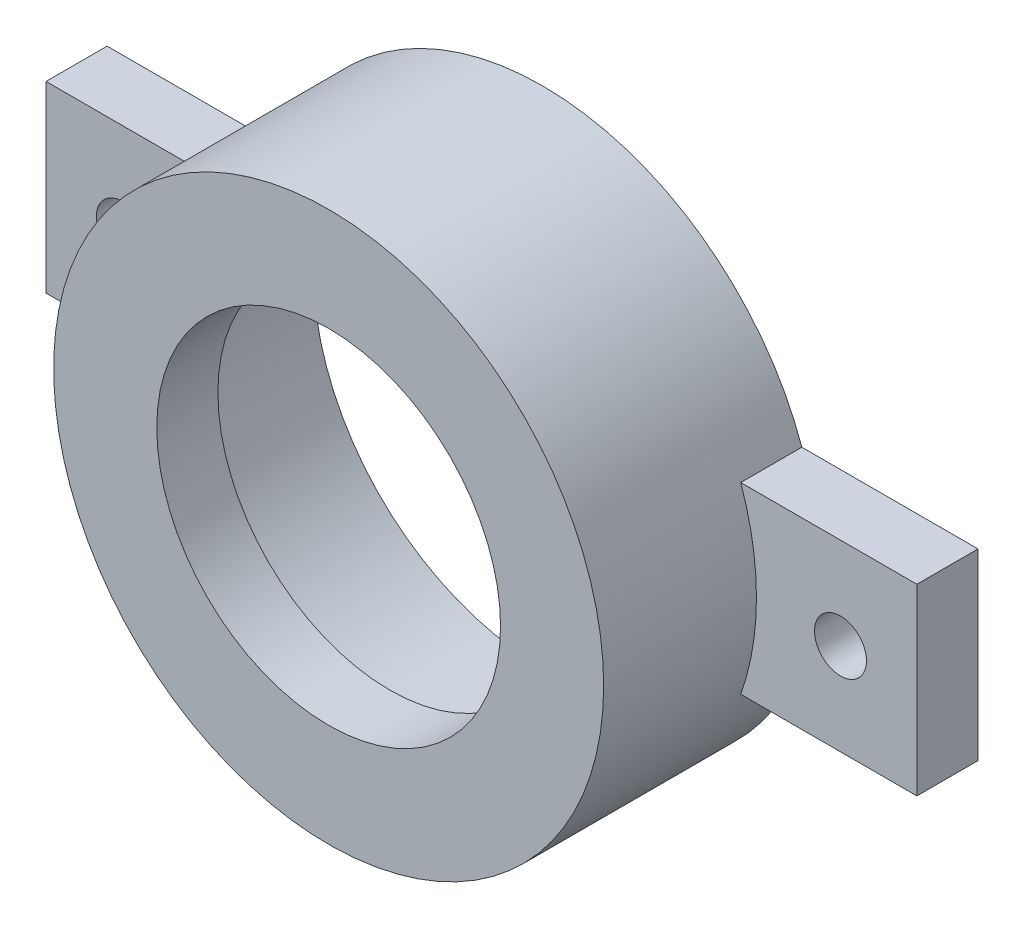
ISO-10303-21;
HEADER;
FILE_DESCRIPTION(('STEP AP214'),'2;1');
FILE_NAME('part.step','',(''),(''),'','','');
FILE_SCHEMA(('AUTOMOTIVE_DESIGN { 1 0 10303 214 1 1 1 1 }'));
ENDSEC;
DATA;
#1=APPLICATION_CONTEXT('core data for automotive mechanical design processes');
#2=APPLICATION_PROTOCOL_DEFINITION('international standard','automotive_design',2000,#1);
#3=PRODUCT_CONTEXT('',#1,'mechanical');
#4=PRODUCT('Part','Part','',(#3));
#5=PRODUCT_RELATED_PRODUCT_CATEGORY('part','',(#4));
#6=PRODUCT_DEFINITION_FORMATION('','',#4);
#7=PRODUCT_DEFINITION_CONTEXT('part definition',#1,'design');
#8=PRODUCT_DEFINITION('design','',#6,#7);
#9=PRODUCT_DEFINITION_SHAPE('','',#8);
#10=(LENGTH_UNIT() NAMED_UNIT(*) SI_UNIT(.MILLI.,.METRE.));
#11=(NAMED_UNIT(*) PLANE_ANGLE_UNIT() SI_UNIT($,.RADIAN.));
#12=(NAMED_UNIT(*) SI_UNIT($,.STERADIAN.) SOLID_ANGLE_UNIT());
#13=UNCERTAINTY_MEASURE_WITH_UNIT(LENGTH_MEASURE(1.E-05),#10,'distance_accuracy_value','');
#14=(GEOMETRIC_REPRESENTATION_CONTEXT(3) GLOBAL_UNCERTAINTY_ASSIGNED_CONTEXT((#13)) GLOBAL_UNIT_ASSIGNED_CONTEXT((#10,
#11,#12)) REPRESENTATION_CONTEXT('',''));
#15=CARTESIAN_POINT('',(0.,0.,0.));
#16=DIRECTION('',(0.,0.,1.));
#17=DIRECTION('',(1.,0.,0.));
#18=AXIS2_PLACEMENT_3D('',#15,#16,#17);
#19=CARTESIAN_POINT('',(-180.,0.,83.));
#20=DIRECTION('',(0.,0.,1.));
#21=DIRECTION('',(1.,0.,0.));
#22=AXIS2_PLACEMENT_3D('',#19,#20,#21);
#23=PLANE('',#22);
#24=CARTESIAN_POINT('',(-180.,0.,83.));
#25=DIRECTION('',(0.,0.,1.));
#26=DIRECTION('',(1.,0.,0.));
#27=AXIS2_PLACEMENT_3D('',#24,#25,#26);
#28=CIRCLE('',#27,11.25);
#29=CARTESIAN_POINT('',(-168.75,0.,83.));
#30=VERTEX_POINT('',#29);
#31=EDGE_CURVE('E9',#30,#30,#28,.T.);
#32=ORIENTED_EDGE('',*,*,#31,.T.);
#33=EDGE_LOOP('',(#32));
#34=FACE_BOUND('',#33,.T.);
#35=CARTESIAN_POINT('',(-180.,0.,83.));
#36=DIRECTION('',(0.,0.,1.));
#37=DIRECTION('',(1.,0.,0.));
#38=AXIS2_PLACEMENT_3D('',#35,#36,#37);
#39=CIRCLE('',#38,15.);
#40=CARTESIAN_POINT('',(-165.,0.,83.));
#41=VERTEX_POINT('',#40);
#42=EDGE_CURVE('E277',#41,#41,#39,.T.);
#43=ORIENTED_EDGE('',*,*,#42,.F.);
#44=EDGE_LOOP('',(#43));
#45=FACE_BOUND('',#44,.T.);
#46=ADVANCED_FACE('F14',(#34,#45),#23,.F.);
#47=CARTESIAN_POINT('',(-180.,0.,53.));
#48=DIRECTION('',(0.,0.,1.));
#49=DIRECTION('',(1.,0.,0.));
#50=AXIS2_PLACEMENT_3D('',#47,#48,#49);
#51=CYLINDRICAL_SURFACE('',#50,11.25);
#52=DIRECTION('',(0.,0.,1.));
#53=VECTOR('',#52,1.);
#54=CARTESIAN_POINT('',(-168.75,0.,53.));
#55=LINE('',#54,#53);
#56=CARTESIAN_POINT('',(-168.75,0.,87.));
#57=VERTEX_POINT('',#56);
#58=EDGE_CURVE('E25',#30,#57,#55,.T.);
#59=ORIENTED_EDGE('',*,*,#58,.F.);
#60=ORIENTED_EDGE('',*,*,#31,.F.);
#61=ORIENTED_EDGE('',*,*,#58,.T.);
#62=CARTESIAN_POINT('',(-180.,0.,87.));
#63=DIRECTION('',(0.,0.,1.));
#64=DIRECTION('',(1.,0.,0.));
#65=AXIS2_PLACEMENT_3D('',#62,#63,#64);
#66=CIRCLE('',#65,11.25);
#67=EDGE_CURVE('E262',#57,#57,#66,.T.);
#68=ORIENTED_EDGE('',*,*,#67,.T.);
#69=EDGE_LOOP('',(#59,#60,#61,#68));
#70=FACE_BOUND('',#69,.T.);
#71=ADVANCED_FACE('F326',(#70),#51,.F.);
#72=CARTESIAN_POINT('',(-180.,0.,72.99));
#73=DIRECTION('',(0.,0.,1.));
#74=DIRECTION('',(1.,0.,0.));
#75=AXIS2_PLACEMENT_3D('',#72,#73,#74);
#76=CYLINDRICAL_SURFACE('',#75,15.);
#77=CARTESIAN_POINT('',(-180.,0.,73.));
#78=DIRECTION('',(0.,0.,1.));
#79=DIRECTION('',(1.,0.,0.));
#80=AXIS2_PLACEMENT_3D('',#77,#78,#79);
#81=CIRCLE('',#80,15.);
#82=CARTESIAN_POINT('',(-165.,0.,73.));
#83=VERTEX_POINT('',#82);
#84=EDGE_CURVE('E244',#83,#83,#81,.T.);
#85=ORIENTED_EDGE('',*,*,#84,.F.);
#86=DIRECTION('',(0.,0.,1.));
#87=VECTOR('',#86,1.);
#88=CARTESIAN_POINT('',(-165.,0.,72.99));
#89=LINE('',#88,#87);
#90=EDGE_CURVE('E268',#83,#41,#89,.T.);
#91=ORIENTED_EDGE('',*,*,#90,.T.);
#92=ORIENTED_EDGE('',*,*,#42,.T.);
#93=ORIENTED_EDGE('',*,*,#90,.F.);
#94=EDGE_LOOP('',(#85,#91,#92,#93));
#95=FACE_BOUND('',#94,.T.);
#96=ADVANCED_FACE('F345',(#95),#76,.F.);
#97=CARTESIAN_POINT('',(-203.5,0.,72.99));
#98=DIRECTION('',(0.,0.,1.));
#99=DIRECTION('',(1.,0.,0.));
#100=AXIS2_PLACEMENT_3D('',#97,#98,#99);
#101=CYLINDRICAL_SURFACE('',#100,1.7);
#102=DIRECTION('',(0.,0.,1.));
#103=VECTOR('',#102,1.);
#104=CARTESIAN_POINT('',(-201.8,0.,72.99));
#105=LINE('',#104,#103);
#106=CARTESIAN_POINT('',(-201.8,0.,73.));
#107=VERTEX_POINT('',#106);
#108=CARTESIAN_POINT('',(-201.8,0.,77.));
#109=VERTEX_POINT('',#108);
#110=EDGE_CURVE('E261',#107,#109,#105,.T.);
#111=ORIENTED_EDGE('',*,*,#110,.F.);
#112=CARTESIAN_POINT('',(-203.5,0.,73.));
#113=DIRECTION('',(0.,0.,1.));
#114=DIRECTION('',(1.,0.,0.));
#115=AXIS2_PLACEMENT_3D('',#112,#113,#114);
#116=CIRCLE('',#115,1.7);
#117=EDGE_CURVE('E130',#107,#107,#116,.T.);
#118=ORIENTED_EDGE('',*,*,#117,.F.);
#119=ORIENTED_EDGE('',*,*,#110,.T.);
#120=CARTESIAN_POINT('',(-203.5,0.,77.));
#121=DIRECTION('',(0.,0.,1.));
#122=DIRECTION('',(1.,0.,0.));
#123=AXIS2_PLACEMENT_3D('',#120,#121,#122);
#124=CIRCLE('',#123,1.7);
#125=EDGE_CURVE('E174',#109,#109,#124,.T.);
#126=ORIENTED_EDGE('',*,*,#125,.T.);
#127=EDGE_LOOP('',(#111,#118,#119,#126));
#128=FACE_BOUND('',#127,.T.);
#129=ADVANCED_FACE('F349',(#128),#101,.F.);
#130=CARTESIAN_POINT('',(-208.5,-6.,73.));
#131=DIRECTION('',(1.,0.,0.));
#132=DIRECTION('',(0.,1.,0.));
#133=AXIS2_PLACEMENT_3D('',#130,#131,#132);
#134=PLANE('',#133);
#135=DIRECTION('',(0.,1.,0.));
#136=VECTOR('',#135,1.);
#137=CARTESIAN_POINT('',(-208.5,-6.,77.));
#138=LINE('',#137,#136);
#139=CARTESIAN_POINT('',(-208.5,-6.,77.));
#140=VERTEX_POINT('',#139);
#141=CARTESIAN_POINT('',(-208.5,6.,77.));
#142=VERTEX_POINT('',#141);
#143=EDGE_CURVE('E165',#140,#142,#138,.T.);
#144=ORIENTED_EDGE('',*,*,#143,.T.);
#145=DIRECTION('',(0.,0.,1.));
#146=VECTOR('',#145,1.);
#147=CARTESIAN_POINT('',(-208.5,6.,73.));
#148=LINE('',#147,#146);
#149=CARTESIAN_POINT('',(-208.5,6.,73.));
#150=VERTEX_POINT('',#149);
#151=EDGE_CURVE('E157',#150,#142,#148,.T.);
#152=ORIENTED_EDGE('',*,*,#151,.F.);
#153=DIRECTION('',(0.,1.,0.));
#154=VECTOR('',#153,1.);
#155=CARTESIAN_POINT('',(-208.5,-6.,73.));
#156=LINE('',#155,#154);
#157=CARTESIAN_POINT('',(-208.5,-6.,73.));
#158=VERTEX_POINT('',#157);
#159=EDGE_CURVE('E190',#158,#150,#156,.T.);
#160=ORIENTED_EDGE('',*,*,#159,.F.);
#161=DIRECTION('',(0.,0.,1.));
#162=VECTOR('',#161,1.);
#163=CARTESIAN_POINT('',(-208.5,-6.,73.));
#164=LINE('',#163,#162);
#165=EDGE_CURVE('E159',#158,#140,#164,.T.);
#166=ORIENTED_EDGE('',*,*,#165,.T.);
#167=EDGE_LOOP('',(#144,#152,#160,#166));
#168=FACE_BOUND('',#167,.T.);
#169=ADVANCED_FACE('F352',(#168),#134,.F.);
#170=CARTESIAN_POINT('',(-156.5,0.,72.99));
#171=DIRECTION('',(0.,0.,1.));
#172=DIRECTION('',(1.,0.,0.));
#173=AXIS2_PLACEMENT_3D('',#170,#171,#172);
#174=CYLINDRICAL_SURFACE('',#173,1.7);
#175=DIRECTION('',(0.,0.,1.));
#176=VECTOR('',#175,1.);
#177=CARTESIAN_POINT('',(-154.8,0.,72.99));
#178=LINE('',#177,#176);
#179=CARTESIAN_POINT('',(-154.8,0.,73.));
#180=VERTEX_POINT('',#179);
#181=CARTESIAN_POINT('',(-154.8,0.,77.));
#182=VERTEX_POINT('',#181);
#183=EDGE_CURVE('E258',#180,#182,#178,.T.);
#184=ORIENTED_EDGE('',*,*,#183,.F.);
#185=CARTESIAN_POINT('',(-156.5,0.,73.));
#186=DIRECTION('',(0.,0.,1.));
#187=DIRECTION('',(1.,0.,0.));
#188=AXIS2_PLACEMENT_3D('',#185,#186,#187);
#189=CIRCLE('',#188,1.7);
#190=EDGE_CURVE('E217',#180,#180,#189,.T.);
#191=ORIENTED_EDGE('',*,*,#190,.F.);
#192=ORIENTED_EDGE('',*,*,#183,.T.);
#193=CARTESIAN_POINT('',(-156.5,0.,77.));
#194=DIRECTION('',(0.,0.,1.));
#195=DIRECTION('',(1.,0.,0.));
#196=AXIS2_PLACEMENT_3D('',#193,#194,#195);
#197=CIRCLE('',#196,1.7);
#198=EDGE_CURVE('E147',#182,#182,#197,.T.);
#199=ORIENTED_EDGE('',*,*,#198,.T.);
#200=EDGE_LOOP('',(#184,#191,#192,#199));
#201=FACE_BOUND('',#200,.T.);
#202=ADVANCED_FACE('F257',(#201),#174,.F.);
#203=CARTESIAN_POINT('',(-151.5,-6.,73.));
#204=DIRECTION('',(1.,0.,0.));
#205=DIRECTION('',(0.,1.,0.));
#206=AXIS2_PLACEMENT_3D('',#203,#204,#205);
#207=PLANE('',#206);
#208=DIRECTION('',(0.,0.,1.));
#209=VECTOR('',#208,1.);
#210=CARTESIAN_POINT('',(-151.5,-6.,73.));
#211=LINE('',#210,#209);
#212=CARTESIAN_POINT('',(-151.5,-6.,73.));
#213=VERTEX_POINT('',#212);
#214=CARTESIAN_POINT('',(-151.5,-6.,77.));
#215=VERTEX_POINT('',#214);
#216=EDGE_CURVE('E135',#213,#215,#211,.T.);
#217=ORIENTED_EDGE('',*,*,#216,.F.);
#218=DIRECTION('',(0.,1.,0.));
#219=VECTOR('',#218,1.);
#220=CARTESIAN_POINT('',(-151.5,-6.,73.));
#221=LINE('',#220,#219);
#222=CARTESIAN_POINT('',(-151.5,6.,73.));
#223=VERTEX_POINT('',#222);
#224=EDGE_CURVE('E118',#213,#223,#221,.T.);
#225=ORIENTED_EDGE('',*,*,#224,.T.);
#226=DIRECTION('',(0.,0.,1.));
#227=VECTOR('',#226,1.);
#228=CARTESIAN_POINT('',(-151.5,6.,73.));
#229=LINE('',#228,#227);
#230=CARTESIAN_POINT('',(-151.5,6.,77.));
#231=VERTEX_POINT('',#230);
#232=EDGE_CURVE('E270',#223,#231,#229,.T.);
#233=ORIENTED_EDGE('',*,*,#232,.T.);
#234=DIRECTION('',(0.,1.,0.));
#235=VECTOR('',#234,1.);
#236=CARTESIAN_POINT('',(-151.5,-6.,77.));
#237=LINE('',#236,#235);
#238=EDGE_CURVE('E18',#215,#231,#237,.T.);
#239=ORIENTED_EDGE('',*,*,#238,.F.);
#240=EDGE_LOOP('',(#217,#225,#233,#239));
#241=FACE_BOUND('',#240,.T.);
#242=ADVANCED_FACE('F143',(#241),#207,.T.);
#243=CARTESIAN_POINT('',(-180.,0.,87.));
#244=DIRECTION('',(0.,0.,1.));
#245=DIRECTION('',(1.,0.,0.));
#246=AXIS2_PLACEMENT_3D('',#243,#244,#245);
#247=PLANE('',#246);
#248=ORIENTED_EDGE('',*,*,#67,.F.);
#249=EDGE_LOOP('',(#248));
#250=FACE_BOUND('',#249,.T.);
#251=CARTESIAN_POINT('',(-180.,0.,87.));
#252=DIRECTION('',(0.,0.,1.));
#253=DIRECTION('',(1.,0.,0.));
#254=AXIS2_PLACEMENT_3D('',#251,#252,#253);
#255=CIRCLE('',#254,18.);
#256=CARTESIAN_POINT('',(-162.,0.,87.));
#257=VERTEX_POINT('',#256);
#258=EDGE_CURVE('E220',#257,#257,#255,.T.);
#259=ORIENTED_EDGE('',*,*,#258,.T.);
#260=EDGE_LOOP('',(#259));
#261=FACE_BOUND('',#260,.T.);
#262=ADVANCED_FACE('F329',(#250,#261),#247,.T.);
#263=CARTESIAN_POINT('',(-208.5,6.,73.));
#264=DIRECTION('',(0.,1.,0.));
#265=DIRECTION('',(1.,0.,0.));
#266=AXIS2_PLACEMENT_3D('',#263,#264,#265);
#267=PLANE('',#266);
#268=DIRECTION('',(1.,0.,0.));
#269=VECTOR('',#268,1.);
#270=CARTESIAN_POINT('',(-208.5,6.,73.));
#271=LINE('',#270,#269);
#272=CARTESIAN_POINT('',(-163.0294372515,6.,73.));
#273=VERTEX_POINT('',#272);
#274=EDGE_CURVE('E126',#273,#223,#271,.T.);
#275=ORIENTED_EDGE('',*,*,#274,.F.);
#276=DIRECTION('',(0.,0.,1.));
#277=VECTOR('',#276,1.);
#278=CARTESIAN_POINT('',(-163.0294372515,6.,73.));
#279=LINE('',#278,#277);
#280=CARTESIAN_POINT('',(-163.0294372515,6.,77.));
#281=VERTEX_POINT('',#280);
#282=EDGE_CURVE('E210',#273,#281,#279,.T.);
#283=ORIENTED_EDGE('',*,*,#282,.T.);
#284=DIRECTION('',(1.,0.,0.));
#285=VECTOR('',#284,1.);
#286=CARTESIAN_POINT('',(-208.5,6.,77.));
#287=LINE('',#286,#285);
#288=EDGE_CURVE('E238',#281,#231,#287,.T.);
#289=ORIENTED_EDGE('',*,*,#288,.T.);
#290=ORIENTED_EDGE('',*,*,#232,.F.);
#291=EDGE_LOOP('',(#275,#283,#289,#290));
#292=FACE_BOUND('',#291,.T.);
#293=ADVANCED_FACE('F294',(#292),#267,.T.);
#294=CARTESIAN_POINT('',(-208.5,6.,73.));
#295=DIRECTION('',(0.,1.,0.));
#296=DIRECTION('',(1.,0.,0.));
#297=AXIS2_PLACEMENT_3D('',#294,#295,#296);
#298=PLANE('',#297);
#299=DIRECTION('',(1.,0.,0.));
#300=VECTOR('',#299,1.);
#301=CARTESIAN_POINT('',(-208.5,6.,73.));
#302=LINE('',#301,#300);
#303=CARTESIAN_POINT('',(-196.9705627484,6.,73.));
#304=VERTEX_POINT('',#303);
#305=EDGE_CURVE('E193',#150,#304,#302,.T.);
#306=ORIENTED_EDGE('',*,*,#305,.F.);
#307=ORIENTED_EDGE('',*,*,#151,.T.);
#308=DIRECTION('',(1.,0.,0.));
#309=VECTOR('',#308,1.);
#310=CARTESIAN_POINT('',(-208.5,6.,77.));
#311=LINE('',#310,#309);
#312=CARTESIAN_POINT('',(-196.9705627484,6.,77.));
#313=VERTEX_POINT('',#312);
#314=EDGE_CURVE('E162',#142,#313,#311,.T.);
#315=ORIENTED_EDGE('',*,*,#314,.T.);
#316=DIRECTION('',(0.,0.,1.));
#317=VECTOR('',#316,1.);
#318=CARTESIAN_POINT('',(-196.9705627484,6.,73.));
#319=LINE('',#318,#317);
#320=EDGE_CURVE('E282',#304,#313,#319,.T.);
#321=ORIENTED_EDGE('',*,*,#320,.F.);
#322=EDGE_LOOP('',(#306,#307,#315,#321));
#323=FACE_BOUND('',#322,.T.);
#324=ADVANCED_FACE('F337',(#323),#298,.T.);
#325=CARTESIAN_POINT('',(-208.5,-6.,77.));
#326=DIRECTION('',(0.,0.,1.));
#327=DIRECTION('',(1.,0.,0.));
#328=AXIS2_PLACEMENT_3D('',#325,#326,#327);
#329=PLANE('',#328);
#330=ORIENTED_EDGE('',*,*,#125,.F.);
#331=EDGE_LOOP('',(#330));
#332=FACE_BOUND('',#331,.T.);
#333=ORIENTED_EDGE('',*,*,#314,.F.);
#334=ORIENTED_EDGE('',*,*,#143,.F.);
#335=DIRECTION('',(1.,0.,0.));
#336=VECTOR('',#335,1.);
#337=CARTESIAN_POINT('',(-208.5,-6.,77.));
#338=LINE('',#337,#336);
#339=CARTESIAN_POINT('',(-196.9705627484,-6.,77.));
#340=VERTEX_POINT('',#339);
#341=EDGE_CURVE('E163',#140,#340,#338,.T.);
#342=ORIENTED_EDGE('',*,*,#341,.T.);
#343=CARTESIAN_POINT('',(-180.,0.,77.));
#344=DIRECTION('',(0.,0.,1.));
#345=DIRECTION('',(1.,0.,0.));
#346=AXIS2_PLACEMENT_3D('',#343,#344,#345);
#347=CIRCLE('',#346,18.);
#348=EDGE_CURVE('E301',#313,#340,#347,.T.);
#349=ORIENTED_EDGE('',*,*,#348,.F.);
#350=EDGE_LOOP('',(#333,#334,#342,#349));
#351=FACE_BOUND('',#350,.T.);
#352=ADVANCED_FACE('F361',(#332,#351),#329,.T.);
#353=CARTESIAN_POINT('',(-208.5,-6.,73.));
#354=DIRECTION('',(0.,1.,0.));
#355=DIRECTION('',(1.,0.,0.));
#356=AXIS2_PLACEMENT_3D('',#353,#354,#355);
#357=PLANE('',#356);
#358=DIRECTION('',(0.,0.,1.));
#359=VECTOR('',#358,1.);
#360=CARTESIAN_POINT('',(-196.9705627484,-6.,73.));
#361=LINE('',#360,#359);
#362=CARTESIAN_POINT('',(-196.9705627484,-6.,73.));
#363=VERTEX_POINT('',#362);
#364=EDGE_CURVE('E209',#363,#340,#361,.T.);
#365=ORIENTED_EDGE('',*,*,#364,.T.);
#366=ORIENTED_EDGE('',*,*,#341,.F.);
#367=ORIENTED_EDGE('',*,*,#165,.F.);
#368=DIRECTION('',(1.,0.,0.));
#369=VECTOR('',#368,1.);
#370=CARTESIAN_POINT('',(-208.5,-6.,73.));
#371=LINE('',#370,#369);
#372=EDGE_CURVE('E141',#158,#363,#371,.T.);
#373=ORIENTED_EDGE('',*,*,#372,.T.);
#374=EDGE_LOOP('',(#365,#366,#367,#373));
#375=FACE_BOUND('',#374,.T.);
#376=ADVANCED_FACE('F16',(#375),#357,.F.);
#377=CARTESIAN_POINT('',(-180.,0.,73.));
#378=DIRECTION('',(0.,0.,1.));
#379=DIRECTION('',(1.,0.,0.));
#380=AXIS2_PLACEMENT_3D('',#377,#378,#379);
#381=PLANE('',#380);
#382=ORIENTED_EDGE('',*,*,#190,.T.);
#383=EDGE_LOOP('',(#382));
#384=FACE_BOUND('',#383,.T.);
#385=ORIENTED_EDGE('',*,*,#84,.T.);
#386=EDGE_LOOP('',(#385));
#387=FACE_BOUND('',#386,.T.);
#388=ORIENTED_EDGE('',*,*,#117,.T.);
#389=EDGE_LOOP('',(#388));
#390=FACE_BOUND('',#389,.T.);
#391=ORIENTED_EDGE('',*,*,#372,.F.);
#392=ORIENTED_EDGE('',*,*,#159,.T.);
#393=ORIENTED_EDGE('',*,*,#305,.T.);
#394=CARTESIAN_POINT('',(-180.,0.,73.));
#395=DIRECTION('',(0.,0.,1.));
#396=DIRECTION('',(1.,0.,0.));
#397=AXIS2_PLACEMENT_3D('',#394,#395,#396);
#398=CIRCLE('',#397,18.);
#399=EDGE_CURVE('E214',#273,#304,#398,.T.);
#400=ORIENTED_EDGE('',*,*,#399,.F.);
#401=ORIENTED_EDGE('',*,*,#274,.T.);
#402=ORIENTED_EDGE('',*,*,#224,.F.);
#403=DIRECTION('',(1.,0.,0.));
#404=VECTOR('',#403,1.);
#405=CARTESIAN_POINT('',(-208.5,-6.,73.));
#406=LINE('',#405,#404);
#407=CARTESIAN_POINT('',(-163.0294372515,-6.,73.));
#408=VERTEX_POINT('',#407);
#409=EDGE_CURVE('E123',#408,#213,#406,.T.);
#410=ORIENTED_EDGE('',*,*,#409,.F.);
#411=CARTESIAN_POINT('',(-180.,0.,73.));
#412=DIRECTION('',(0.,0.,1.));
#413=DIRECTION('',(1.,0.,0.));
#414=AXIS2_PLACEMENT_3D('',#411,#412,#413);
#415=CIRCLE('',#414,18.);
#416=EDGE_CURVE('E206',#363,#408,#415,.T.);
#417=ORIENTED_EDGE('',*,*,#416,.F.);
#418=EDGE_LOOP('',(#391,#392,#393,#400,#401,#402,#410,#417));
#419=FACE_BOUND('',#418,.T.);
#420=ADVANCED_FACE('F121',(#384,#387,#390,#419),#381,.F.);
#421=CARTESIAN_POINT('',(-208.5,-6.,73.));
#422=DIRECTION('',(0.,1.,0.));
#423=DIRECTION('',(1.,0.,0.));
#424=AXIS2_PLACEMENT_3D('',#421,#422,#423);
#425=PLANE('',#424);
#426=ORIENTED_EDGE('',*,*,#216,.T.);
#427=DIRECTION('',(1.,0.,0.));
#428=VECTOR('',#427,1.);
#429=CARTESIAN_POINT('',(-208.5,-6.,77.));
#430=LINE('',#429,#428);
#431=CARTESIAN_POINT('',(-163.0294372515,-6.,77.));
#432=VERTEX_POINT('',#431);
#433=EDGE_CURVE('E242',#432,#215,#430,.T.);
#434=ORIENTED_EDGE('',*,*,#433,.F.);
#435=DIRECTION('',(0.,0.,1.));
#436=VECTOR('',#435,1.);
#437=CARTESIAN_POINT('',(-163.0294372515,-6.,73.));
#438=LINE('',#437,#436);
#439=EDGE_CURVE('E138',#408,#432,#438,.T.);
#440=ORIENTED_EDGE('',*,*,#439,.F.);
#441=ORIENTED_EDGE('',*,*,#409,.T.);
#442=EDGE_LOOP('',(#426,#434,#440,#441));
#443=FACE_BOUND('',#442,.T.);
#444=ADVANCED_FACE('F133',(#443),#425,.F.);
#445=CARTESIAN_POINT('',(-208.5,-6.,77.));
#446=DIRECTION('',(0.,0.,1.));
#447=DIRECTION('',(1.,0.,0.));
#448=AXIS2_PLACEMENT_3D('',#445,#446,#447);
#449=PLANE('',#448);
#450=ORIENTED_EDGE('',*,*,#198,.F.);
#451=EDGE_LOOP('',(#450));
#452=FACE_BOUND('',#451,.T.);
#453=ORIENTED_EDGE('',*,*,#288,.F.);
#454=CARTESIAN_POINT('',(-180.,0.,77.));
#455=DIRECTION('',(0.,0.,1.));
#456=DIRECTION('',(1.,0.,0.));
#457=AXIS2_PLACEMENT_3D('',#454,#455,#456);
#458=CIRCLE('',#457,18.);
#459=CARTESIAN_POINT('',(-162.,0.,77.));
#460=VERTEX_POINT('',#459);
#461=EDGE_CURVE('E215',#460,#281,#458,.T.);
#462=ORIENTED_EDGE('',*,*,#461,.F.);
#463=CARTESIAN_POINT('',(-180.,0.,77.));
#464=DIRECTION('',(0.,0.,1.));
#465=DIRECTION('',(1.,0.,0.));
#466=AXIS2_PLACEMENT_3D('',#463,#464,#465);
#467=CIRCLE('',#466,18.);
#468=EDGE_CURVE('E243',#432,#460,#467,.T.);
#469=ORIENTED_EDGE('',*,*,#468,.F.);
#470=ORIENTED_EDGE('',*,*,#433,.T.);
#471=ORIENTED_EDGE('',*,*,#238,.T.);
#472=EDGE_LOOP('',(#453,#462,#469,#470,#471));
#473=FACE_BOUND('',#472,.T.);
#474=ADVANCED_FACE('F292',(#452,#473),#449,.T.);
#475=CARTESIAN_POINT('',(-180.,0.,73.));
#476=DIRECTION('',(0.,0.,1.));
#477=DIRECTION('',(1.,0.,0.));
#478=AXIS2_PLACEMENT_3D('',#475,#476,#477);
#479=CYLINDRICAL_SURFACE('',#478,18.);
#480=DIRECTION('',(0.,0.,1.));
#481=VECTOR('',#480,1.);
#482=CARTESIAN_POINT('',(-162.,0.,73.));
#483=LINE('',#482,#481);
#484=EDGE_CURVE('E185',#460,#257,#483,.T.);
#485=ORIENTED_EDGE('',*,*,#484,.T.);
#486=ORIENTED_EDGE('',*,*,#258,.F.);
#487=ORIENTED_EDGE('',*,*,#484,.F.);
#488=ORIENTED_EDGE('',*,*,#461,.T.);
#489=ORIENTED_EDGE('',*,*,#282,.F.);
#490=ORIENTED_EDGE('',*,*,#399,.T.);
#491=ORIENTED_EDGE('',*,*,#320,.T.);
#492=ORIENTED_EDGE('',*,*,#348,.T.);
#493=ORIENTED_EDGE('',*,*,#364,.F.);
#494=ORIENTED_EDGE('',*,*,#416,.T.);
#495=ORIENTED_EDGE('',*,*,#439,.T.);
#496=ORIENTED_EDGE('',*,*,#468,.T.);
#497=EDGE_LOOP('',(#485,#486,#487,#488,#489,#490,#491,#492,#493,#494,#495,#496));
#498=FACE_BOUND('',#497,.T.);
#499=ADVANCED_FACE('F297',(#498),#479,.T.);
#500=CLOSED_SHELL('',(#46,#71,#96,#129,#169,#202,#242,#262,#293,#324,#352,#376,#420,#444,#474,#499));
#501=MANIFOLD_SOLID_BREP('B1',#500);
#502=ADVANCED_BREP_SHAPE_REPRESENTATION('',(#18,#501),#14);
#503=SHAPE_DEFINITION_REPRESENTATION(#9,#502);
ENDSEC;
END-ISO-10303-21;
